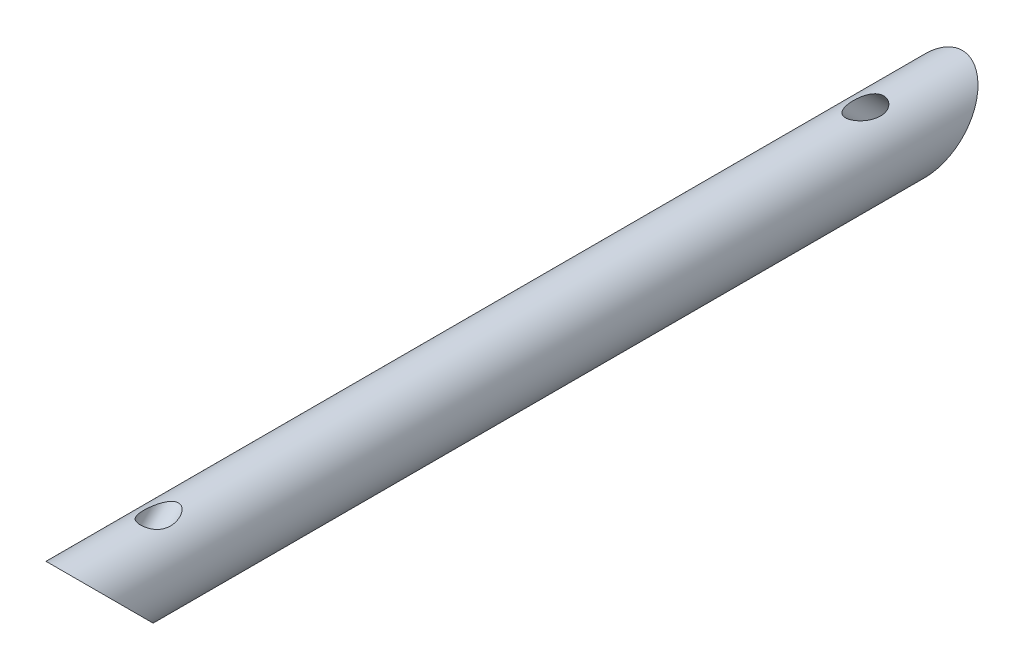
ISO-10303-21;
HEADER;
FILE_DESCRIPTION(('STEP AP214'),'2;1');
FILE_NAME('part.step','',(''),(''),'','','');
FILE_SCHEMA(('AUTOMOTIVE_DESIGN { 1 0 10303 214 1 1 1 1 }'));
ENDSEC;
DATA;
#1=APPLICATION_CONTEXT('core data for automotive mechanical design processes');
#2=APPLICATION_PROTOCOL_DEFINITION('international standard','automotive_design',2000,#1);
#3=PRODUCT_CONTEXT('',#1,'mechanical');
#4=PRODUCT('Part','Part','',(#3));
#5=PRODUCT_RELATED_PRODUCT_CATEGORY('part','',(#4));
#6=PRODUCT_DEFINITION_FORMATION('','',#4);
#7=PRODUCT_DEFINITION_CONTEXT('part definition',#1,'design');
#8=PRODUCT_DEFINITION('design','',#6,#7);
#9=PRODUCT_DEFINITION_SHAPE('','',#8);
#10=(LENGTH_UNIT() NAMED_UNIT(*) SI_UNIT(.MILLI.,.METRE.));
#11=(NAMED_UNIT(*) PLANE_ANGLE_UNIT() SI_UNIT($,.RADIAN.));
#12=(NAMED_UNIT(*) SI_UNIT($,.STERADIAN.) SOLID_ANGLE_UNIT());
#13=UNCERTAINTY_MEASURE_WITH_UNIT(LENGTH_MEASURE(1.E-05),#10,'distance_accuracy_value','');
#14=(GEOMETRIC_REPRESENTATION_CONTEXT(3) GLOBAL_UNCERTAINTY_ASSIGNED_CONTEXT((#13)) GLOBAL_UNIT_ASSIGNED_CONTEXT((#10,
#11,#12)) REPRESENTATION_CONTEXT('',''));
#15=CARTESIAN_POINT('',(0.,0.,0.));
#16=DIRECTION('',(0.,0.,1.));
#17=DIRECTION('',(1.,0.,0.));
#18=AXIS2_PLACEMENT_3D('',#15,#16,#17);
#19=CARTESIAN_POINT('',(0.,0.,63.3730000000001));
#20=DIRECTION('',(0.,0.,-1.));
#21=DIRECTION('',(-1.,0.,0.));
#22=AXIS2_PLACEMENT_3D('',#19,#20,#21);
#23=CYLINDRICAL_SURFACE('',#22,3.175);
#24=CARTESIAN_POINT('',(0.,3.17500000000001,62.4760573640767));
#25=CARTESIAN_POINT('',(0.0374834130594243,3.17499908283403,62.4760613231574));
#26=CARTESIAN_POINT('',(0.0749864602227436,3.17432824369062,62.4793917521914));
#27=CARTESIAN_POINT('',(0.148840239387552,3.17172577653786,62.4923781259647));
#28=CARTESIAN_POINT('',(0.185189481485274,3.16979258277647,62.5020419263077));
#29=CARTESIAN_POINT('',(0.263964599226041,3.16430769845105,62.5296895493285));
#30=CARTESIAN_POINT('',(0.305876380743758,3.16048678870583,62.5490716760683));
#31=CARTESIAN_POINT('',(0.385947639527939,3.15171406014512,62.5942326241791));
#32=CARTESIAN_POINT('',(0.424100075551041,3.1467601747919,62.6200231419252));
#33=CARTESIAN_POINT('',(0.515526607482378,3.13336519861989,62.6910693929809));
#34=CARTESIAN_POINT('',(0.566279936152403,3.12445489309156,62.7394529188589));
#35=CARTESIAN_POINT('',(0.659831061636663,3.10604683939804,62.8432555241803));
#36=CARTESIAN_POINT('',(0.702608452299118,3.09654766508919,62.8986920556618));
#37=CARTESIAN_POINT('',(0.77455904781887,3.07925393670788,63.0045228631761));
#38=CARTESIAN_POINT('',(0.804810066878168,3.0714417548507,63.0541937230361));
#39=CARTESIAN_POINT('',(0.860956606989947,3.05617779839635,63.1560073775087));
#40=CARTESIAN_POINT('',(0.886849279579085,3.04872626175313,63.2081517604172));
#41=CARTESIAN_POINT('',(0.958551604640009,3.02726303952095,63.3675351626859));
#42=CARTESIAN_POINT('',(0.998335893117838,3.01415574687032,63.4776477301824));
#43=CARTESIAN_POINT('',(1.06465224579865,2.99139012604209,63.7086735014768));
#44=CARTESIAN_POINT('',(1.09033685782707,2.9819606500878,63.8298477802075));
#45=CARTESIAN_POINT('',(1.12407490937722,2.96941569807927,64.0749108763587));
#46=CARTESIAN_POINT('',(1.13215871891452,2.96628934673537,64.1987946447963));
#47=CARTESIAN_POINT('',(1.1283188814641,2.96774425787937,64.4133252434276));
#48=CARTESIAN_POINT('',(1.12113747830104,2.97049949005817,64.5040636885038));
#49=CARTESIAN_POINT('',(1.09377643977065,2.98068999333361,64.6833149182491));
#50=CARTESIAN_POINT('',(1.07361716547831,2.98811793297005,64.7718309640245));
#51=CARTESIAN_POINT('',(1.02392656640359,3.00544976750212,64.9260352488518));
#52=CARTESIAN_POINT('',(0.997149795659033,3.01453828620718,64.9926938741853));
#53=CARTESIAN_POINT('',(0.933258885193411,3.0349263452253,65.1205587889725));
#54=CARTESIAN_POINT('',(0.896148981191769,3.04622497901285,65.1817672989775));
#55=CARTESIAN_POINT('',(0.811034535475646,3.06998499368967,65.2967407676653));
#56=CARTESIAN_POINT('',(0.762940341837362,3.08245541593947,65.3504382580461));
#57=CARTESIAN_POINT('',(0.656855972877726,3.10678350780037,65.4471751138649));
#58=CARTESIAN_POINT('',(0.59887269578391,3.11864159708905,65.4902218578832));
#59=CARTESIAN_POINT('',(0.483752398458739,3.13839458037715,65.5583673755363));
#60=CARTESIAN_POINT('',(0.427659508244409,3.14661295432827,65.5851449737221));
#61=CARTESIAN_POINT('',(0.311319294513365,3.16024128036961,65.6284184231077));
#62=CARTESIAN_POINT('',(0.251073712323428,3.16565240159194,65.6449185551231));
#63=CARTESIAN_POINT('',(0.132877844354103,3.17273069099798,65.6663121983137));
#64=CARTESIAN_POINT('',(0.0750770093909175,3.1746404826761,65.6719593058805));
#65=CARTESIAN_POINT('',(-0.0406882054461955,3.17526639942542,65.6738209678093));
#66=CARTESIAN_POINT('',(-0.0986525492962794,3.17398318027839,65.6700374590346));
#67=CARTESIAN_POINT('',(-0.212132066548627,3.16840703715113,65.6532734898886));
#68=CARTESIAN_POINT('',(-0.267671563389201,3.1641624721143,65.6404407680254));
#69=CARTESIAN_POINT('',(-0.375719770861808,3.15315876329112,65.6060783641478));
#70=CARTESIAN_POINT('',(-0.428228636183161,3.14639974797856,65.58454912647));
#71=CARTESIAN_POINT('',(-0.529326137961713,3.13098738048427,65.533147408008));
#72=CARTESIAN_POINT('',(-0.577872178771755,3.12231642183085,65.5031966196145));
#73=CARTESIAN_POINT('',(-0.669344241558663,3.10399478206767,65.4359477361456));
#74=CARTESIAN_POINT('',(-0.712269879470024,3.09434403408475,65.3986491393996));
#75=CARTESIAN_POINT('',(-0.793582943661123,3.07452225298739,65.315988890584));
#76=CARTESIAN_POINT('',(-0.831672781032669,3.06434762157678,65.270336356299));
#77=CARTESIAN_POINT('',(-0.900559723835022,3.04481521430912,65.1736962132735));
#78=CARTESIAN_POINT('',(-0.931353497572707,3.03545781286076,65.1227061824693));
#79=CARTESIAN_POINT('',(-0.995822114725408,3.01504771798124,64.9972004526731));
#80=CARTESIAN_POINT('',(-1.02635050540501,3.00464794918138,64.9209584949803));
#81=CARTESIAN_POINT('',(-1.07510312122169,2.98754635697353,64.7642412904402));
#82=CARTESIAN_POINT('',(-1.09330243254493,2.9808520262385,64.6837578240325));
#83=CARTESIAN_POINT('',(-1.12373820693937,2.96954915506734,64.4903751090213));
#84=CARTESIAN_POINT('',(-1.13118418540178,2.96666241464113,64.3766310052609));
#85=CARTESIAN_POINT('',(-1.12924715986265,2.96738763591896,64.149352253174));
#86=CARTESIAN_POINT('',(-1.11983476538411,2.97101094712318,64.0358183167452));
#87=CARTESIAN_POINT('',(-1.08574279623247,2.9836450925167,63.8075460841021));
#88=CARTESIAN_POINT('',(-1.06057264832954,2.9928287168412,63.6928904019422));
#89=CARTESIAN_POINT('',(-1.01156464684503,3.00959294678324,63.5246194394453));
#90=CARTESIAN_POINT('',(-0.993354224364481,3.0156788245346,63.4691502208721));
#91=CARTESIAN_POINT('',(-0.953073435845767,3.02865069695383,63.3597330311111));
#92=CARTESIAN_POINT('',(-0.931004137144407,3.0355364702002,63.3057846440511));
#93=CARTESIAN_POINT('',(-0.872137940988828,3.05308478400017,63.1763043221435));
#94=CARTESIAN_POINT('',(-0.833147318510797,3.06406933590551,63.1017956031308));
#95=CARTESIAN_POINT('',(-0.745667716088645,3.08652763180049,62.9586131625505));
#96=CARTESIAN_POINT('',(-0.697191457132747,3.09800070469733,62.8899318009628));
#97=CARTESIAN_POINT('',(-0.606734079972008,3.11670855758641,62.7827188274078));
#98=CARTESIAN_POINT('',(-0.56779751497214,3.12410440310835,62.7416634721007));
#99=CARTESIAN_POINT('',(-0.484280815198043,3.13813411011589,62.6655395755375));
#100=CARTESIAN_POINT('',(-0.439709672285096,3.14476915423217,62.6304617001351));
#101=CARTESIAN_POINT('',(-0.357585960462747,3.1549918577585,62.5772682210178));
#102=CARTESIAN_POINT('',(-0.321395628107924,3.15891836340942,62.5571309183613));
#103=CARTESIAN_POINT('',(-0.246204383149144,3.16566306718166,62.5228161984973));
#104=CARTESIAN_POINT('',(-0.207209727056335,3.16848364710988,62.5086259686217));
#105=CARTESIAN_POINT('',(-0.139995021877297,3.17202970886852,62.4908564220094));
#106=CARTESIAN_POINT('',(-0.112302520526211,3.17313642864312,62.4853366222682));
#107=CARTESIAN_POINT('',(-0.0564103802080994,3.17462191246686,62.4779356378527));
#108=CARTESIAN_POINT('',(-0.0282107508380602,3.1750006902771,62.476054384395));
#109=CARTESIAN_POINT('',(0.,3.17500000000001,62.4760573640767));
#110=B_SPLINE_CURVE_WITH_KNOTS('',3,(#24,#25,#26,#27,#28,#29,#30,#31,#32,#33,#34,#35,#36,#37,
#38,#39,#40,#41,#42,#43,#44,#45,#46,#47,#48,#49,#50,#51,#52,#53,#54,#55,#56,#57,#58,#59,#60,#61,
#62,#63,#64,#65,#66,#67,#68,#69,#70,#71,#72,#73,#74,#75,#76,#77,#78,#79,#80,#81,#82,#83,#84,#85,
#86,#87,#88,#89,#90,#91,#92,#93,#94,#95,#96,#97,#98,#99,#100,#101,#102,#103,#104,#105,#106,#107,
#108,#109),.UNSPECIFIED.,.T.,.F.,(4,2,2,2,2,2,2,2,2,2,2,2,2,2,2,2,2,2,2,2,2,2,2,2,2,2,2,2,2,2,2,
2,2,2,2,2,2,2,2,2,2,2,4),(0.,0.112338138943684,0.224815881000983,0.363045200697871,
0.501528689206786,0.712403256872353,0.923810150563234,1.09960942643569,1.27552315618606,
1.62762445539831,1.99905601239938,2.36984615821917,2.64218930542031,2.91410620939429,
3.1304947907729,3.34679480120354,3.5649276447272,3.78290894526865,3.97000502601979,
4.15702312448349,4.33050584446914,4.50395293744904,4.67463197455428,4.84530229215151,
5.01761527660613,5.1899400297851,5.37015107641281,5.55044425715103,5.79741675173692,
6.04488683564514,6.38509684230392,6.72590054023958,7.07788110944375,7.25385601952704,
7.42978233301633,7.68362662173258,7.93713278990965,8.10789400165331,8.27838606750112,
8.40276522464746,8.52687501823088,8.61142450026314,8.69597238394517),.UNSPECIFIED.);
#111=CARTESIAN_POINT('',(0.,3.17500000000001,62.4760573640767));
#112=VERTEX_POINT('',#111);
#113=EDGE_CURVE('E78',#112,#112,#110,.T.);
#114=ORIENTED_EDGE('',*,*,#113,.T.);
#115=EDGE_LOOP('',(#114));
#116=FACE_BOUND('',#115,.T.);
#117=CARTESIAN_POINT('',(0.,3.17500000000001,3.41499195668189));
#118=CARTESIAN_POINT('',(0.0575469658029136,3.17499616209617,3.41499699623727));
#119=CARTESIAN_POINT('',(0.115156405661768,3.17341834208441,3.41965985241906));
#120=CARTESIAN_POINT('',(0.228797507051827,3.1672595216072,3.4382237108335));
#121=CARTESIAN_POINT('',(0.284825388464469,3.16267187243366,3.45214516623269));
#122=CARTESIAN_POINT('',(0.393524179145294,3.15099123827825,3.48883232281481));
#123=CARTESIAN_POINT('',(0.446200622811635,3.14390251723971,3.51158297812459));
#124=CARTESIAN_POINT('',(0.546863421987397,3.12796513113726,3.56525920498471));
#125=CARTESIAN_POINT('',(0.594852226176735,3.11911739234198,3.59618047683672));
#126=CARTESIAN_POINT('',(0.685885671771446,3.10038510013909,3.66588012000434));
#127=CARTESIAN_POINT('',(0.72882747383953,3.09048493510592,3.70478817301941));
#128=CARTESIAN_POINT('',(0.808040373182122,3.07072738368662,3.78887520339933));
#129=CARTESIAN_POINT('',(0.844309607393002,3.06087000999623,3.83405592601133));
#130=CARTESIAN_POINT('',(0.912569617732397,3.04125125931347,3.93320254384656));
#131=CARTESIAN_POINT('',(0.943975303111413,3.03156242785856,3.98758368991971));
#132=CARTESIAN_POINT('',(0.998874807425657,3.01391798688669,4.10044316795166));
#133=CARTESIAN_POINT('',(1.02236334371748,3.0059635358636,4.15892420421672));
#134=CARTESIAN_POINT('',(1.0719298908264,2.9887481355558,4.30865672342945));
#135=CARTESIAN_POINT('',(1.09337247269132,2.98084101351218,4.40160155124433));
#136=CARTESIAN_POINT('',(1.12198304037733,2.97018409757877,4.58996306585649));
#137=CARTESIAN_POINT('',(1.12912124055668,2.96744506575981,4.68538449225261));
#138=CARTESIAN_POINT('',(1.13088300596502,2.96676866690955,4.84646558334129));
#139=CARTESIAN_POINT('',(1.12871653121573,2.96759971099057,4.91212127252969));
#140=CARTESIAN_POINT('',(1.11911211535354,2.97123572862847,5.04301786207303));
#141=CARTESIAN_POINT('',(1.11167197574718,2.97404152541983,5.10825857798463));
#142=CARTESIAN_POINT('',(1.09183090627415,2.98138247651132,5.2381057173151));
#143=CARTESIAN_POINT('',(1.07941277873249,2.98592362343497,5.30270913793176));
#144=CARTESIAN_POINT('',(1.0497927992154,2.99646583308453,5.43068938274457));
#145=CARTESIAN_POINT('',(1.03259078487595,3.00246694536046,5.4940661652308));
#146=CARTESIAN_POINT('',(0.992949443377114,3.01581246467296,5.62067547410196));
#147=CARTESIAN_POINT('',(0.970396447954191,3.0231851468808,5.68386954628157));
#148=CARTESIAN_POINT('',(0.920081700744097,3.0388765795434,5.80809035855861));
#149=CARTESIAN_POINT('',(0.892316618816012,3.04719593350616,5.86911568317279));
#150=CARTESIAN_POINT('',(0.831377302353052,3.06438154582691,5.98784223189306));
#151=CARTESIAN_POINT('',(0.798238983297259,3.07324394513687,6.04556230101469));
#152=CARTESIAN_POINT('',(0.725834486134612,3.09114573024155,6.15693152095148));
#153=CARTESIAN_POINT('',(0.686579118377622,3.10018477966481,6.21058760987941));
#154=CARTESIAN_POINT('',(0.611996311576122,3.11562804164365,6.29912240470263));
#155=CARTESIAN_POINT('',(0.578231217814853,3.12211497375256,6.3352942635037));
#156=CARTESIAN_POINT('',(0.506387842294441,3.13456957127226,6.40331020610694));
#157=CARTESIAN_POINT('',(0.468306574962877,3.14053687213727,6.43515126030689));
#158=CARTESIAN_POINT('',(0.38707875224875,3.1515864765548,6.49319352138688));
#159=CARTESIAN_POINT('',(0.343871865749023,3.15665603153139,6.51931456728187));
#160=CARTESIAN_POINT('',(0.253176980224138,3.16521337725573,6.56296421896241));
#161=CARTESIAN_POINT('',(0.205703051911683,3.16870615349906,6.58051992127147));
#162=CARTESIAN_POINT('',(0.122052466556337,3.17284503362205,6.60124024272704));
#163=CARTESIAN_POINT('',(0.0865657391472375,3.17402157868842,6.60709491381354));
#164=CARTESIAN_POINT('',(0.0150932107992692,3.17516462603452,6.6127833235844));
#165=CARTESIAN_POINT('',(-0.0208923173915577,3.17513176541098,6.61262023233542));
#166=CARTESIAN_POINT('',(-0.0922506574365333,3.1738601754192,6.60629126227438));
#167=CARTESIAN_POINT('',(-0.12762418667116,3.17262297124839,6.60013297586008));
#168=CARTESIAN_POINT('',(-0.196916977700129,3.16907814432482,6.58237702092394));
#169=CARTESIAN_POINT('',(-0.230835024909652,3.16676964586152,6.5707749023517));
#170=CARTESIAN_POINT('',(-0.308927476958787,3.160260359928,6.53776434834506));
#171=CARTESIAN_POINT('',(-0.352201421470016,3.15567484807595,6.51431180801452));
#172=CARTESIAN_POINT('',(-0.434395065622467,3.14541759745742,6.46092720505872));
#173=CARTESIAN_POINT('',(-0.473304418732735,3.13974336057499,6.43098021971839));
#174=CARTESIAN_POINT('',(-0.567924574947947,3.12434530316837,6.34792083073001));
#175=CARTESIAN_POINT('',(-0.620507862136774,3.11416229495928,6.29135895687439));
#176=CARTESIAN_POINT('',(-0.716554970227561,3.09347517632526,6.17105259666346));
#177=CARTESIAN_POINT('',(-0.759996106363505,3.08297033955873,6.1072908329483));
#178=CARTESIAN_POINT('',(-0.831623971920333,3.06433044943664,5.98728155056329));
#179=CARTESIAN_POINT('',(-0.861145835062884,3.0561168055181,5.93182922875789));
#180=CARTESIAN_POINT('',(-0.915400034143196,3.04030712836007,5.81851572434344));
#181=CARTESIAN_POINT('',(-0.940129449299356,3.0327114733827,5.76065309869586));
#182=CARTESIAN_POINT('',(-0.985104074212775,3.01840213296415,5.64299803153776));
#183=CARTESIAN_POINT('',(-1.005341448774,3.01168999676054,5.58320242329513));
#184=CARTESIAN_POINT('',(-1.04139970289673,2.99941228655682,5.46217806678887));
#185=CARTESIAN_POINT('',(-1.05722034135306,2.99384677515415,5.40094924048497));
#186=CARTESIAN_POINT('',(-1.0849372940593,2.98391710378639,5.27501965223364));
#187=CARTESIAN_POINT('',(-1.09665903766268,2.97960745611445,5.21027598541591));
#188=CARTESIAN_POINT('',(-1.1151053265212,2.97275328562703,5.07996459098223));
#189=CARTESIAN_POINT('',(-1.12182861053366,2.97020920832209,5.01439665962393));
#190=CARTESIAN_POINT('',(-1.12988878316544,2.96715289710561,4.88305003754043));
#191=CARTESIAN_POINT('',(-1.13124058146427,2.96663503906108,4.81727243811314));
#192=CARTESIAN_POINT('',(-1.12806314523369,2.96784443871198,4.68591212183187));
#193=CARTESIAN_POINT('',(-1.12353785634536,2.96957019013864,4.62032930382606));
#194=CARTESIAN_POINT('',(-1.1060256229337,2.97614723731939,4.47413755350166));
#195=CARTESIAN_POINT('',(-1.09124763981754,2.9816568923642,4.39375545263313));
#196=CARTESIAN_POINT('',(-1.05004359419724,2.99641736582071,4.23639903019055));
#197=CARTESIAN_POINT('',(-1.02363465971325,3.0056626813619,4.15941988009198));
#198=CARTESIAN_POINT('',(-0.96333595101923,3.02546368902725,4.02393831884604));
#199=CARTESIAN_POINT('',(-0.931424260390282,3.03554479228619,3.9644937456761));
#200=CARTESIAN_POINT('',(-0.858241589232965,3.05704055100699,3.85189102934531));
#201=CARTESIAN_POINT('',(-0.81697418771904,3.06845469570819,3.79873049403517));
#202=CARTESIAN_POINT('',(-0.725123871829526,3.09145062450973,3.70050460557648));
#203=CARTESIAN_POINT('',(-0.674484647158541,3.10303300962814,3.65549162571844));
#204=CARTESIAN_POINT('',(-0.565234776982635,3.12477525404836,3.57591873857571));
#205=CARTESIAN_POINT('',(-0.506623156485704,3.13493493905075,3.54136011148559));
#206=CARTESIAN_POINT('',(-0.390522490059555,3.1513738712596,3.48745384777546));
#207=CARTESIAN_POINT('',(-0.333670540538712,3.15796388024087,3.46681927893449));
#208=CARTESIAN_POINT('',(-0.217128390472756,3.1681028798409,3.43557909410305));
#209=CARTESIAN_POINT('',(-0.157446224410773,3.17165999183364,3.42494668676382));
#210=CARTESIAN_POINT('',(-0.0649709718946767,3.17450245429316,3.41647145701584));
#211=CARTESIAN_POINT('',(-0.0324954461885266,3.17500216717591,3.41498911096104));
#212=CARTESIAN_POINT('',(0.,3.17500000000001,3.41499195668189));
#213=B_SPLINE_CURVE_WITH_KNOTS('',3,(#117,#118,#119,#120,#121,#122,#123,#124,#125,#126,#127,
#128,#129,#130,#131,#132,#133,#134,#135,#136,#137,#138,#139,#140,#141,#142,#143,#144,#145,#146,
#147,#148,#149,#150,#151,#152,#153,#154,#155,#156,#157,#158,#159,#160,#161,#162,#163,#164,#165,
#166,#167,#168,#169,#170,#171,#172,#173,#174,#175,#176,#177,#178,#179,#180,#181,#182,#183,#184,
#185,#186,#187,#188,#189,#190,#191,#192,#193,#194,#195,#196,#197,#198,#199,#200,#201,#202,#203,
#204,#205,#206,#207,#208,#209,#210,#211,#212),.UNSPECIFIED.,.T.,.F.,(4,2,2,2,2,2,2,2,2,2,2,2,2,
2,2,2,2,2,2,2,2,2,2,2,2,2,2,2,2,2,2,2,2,2,2,2,2,2,2,2,2,2,2,2,2,2,2,4),(0.,0.172541146773812,
0.345464725830227,0.518094910032727,0.690634429770364,0.866235513072081,1.041885552206,
1.23177315798526,1.42178721482838,1.70733429129484,1.99347533972966,2.19033133281801,
2.38726943983662,2.58489386344524,2.78252499520018,2.9848045296782,3.18721374856093,
3.38832194362329,3.58907867892935,3.73850063688532,3.88802659077019,4.03953014036355,
4.19055124861339,4.29802313141185,4.40543840044805,4.51271781403078,4.62008507615875,
4.767550920579,4.91535926663766,5.14775358980532,5.38071793438012,5.57053919548398,
5.7604757827832,5.95074110618428,6.14101681394749,6.33861939531173,6.53627182009256,
6.73337523447895,6.93034638990321,7.17524666148568,7.4197874866527,7.62360612400301,
7.82734692198641,8.03235416315018,8.23738649845634,8.41898905406102,8.60010378031405,
8.69753379199358),.UNSPECIFIED.);
#214=CARTESIAN_POINT('',(0.,3.17500000000001,3.41499195668189));
#215=VERTEX_POINT('',#214);
#216=EDGE_CURVE('E52',#215,#215,#213,.T.);
#217=ORIENTED_EDGE('',*,*,#216,.T.);
#218=EDGE_LOOP('',(#217));
#219=FACE_BOUND('',#218,.T.);
#220=CARTESIAN_POINT('',(0.,0.,69.0880204998591));
#221=DIRECTION('',(0.,-0.707106781186549,0.707106781186547));
#222=DIRECTION('',(0.,-0.707106781186547,-0.707106781186549));
#223=AXIS2_PLACEMENT_3D('',#220,#221,#222);
#224=ELLIPSE('',#223,4.49012806053458,3.175);
#225=CARTESIAN_POINT('',(0.,-3.17500000000003,65.9130204998591));
#226=VERTEX_POINT('',#225);
#227=EDGE_CURVE('E11',#226,#226,#224,.T.);
#228=ORIENTED_EDGE('',*,*,#227,.F.);
#229=EDGE_LOOP('',(#228));
#230=FACE_BOUND('',#229,.T.);
#231=CARTESIAN_POINT('',(0.,0.,0.));
#232=DIRECTION('',(0.,0.707106781186549,0.707106781186547));
#233=DIRECTION('',(0.,0.707106781186547,-0.70710678118655));
#234=AXIS2_PLACEMENT_3D('',#231,#232,#233);
#235=ELLIPSE('',#234,4.49012806053458,3.175);
#236=CARTESIAN_POINT('',(0.,3.175,-3.17500000000001));
#237=VERTEX_POINT('',#236);
#238=EDGE_CURVE('E46',#237,#237,#235,.T.);
#239=ORIENTED_EDGE('',*,*,#238,.T.);
#240=EDGE_LOOP('',(#239));
#241=FACE_BOUND('',#240,.T.);
#242=ADVANCED_FACE('F38',(#116,#219,#230,#241),#23,.T.);
#243=CARTESIAN_POINT('',(0.,-9.75615024992955,59.3318702499296));
#244=DIRECTION('',(0.,-0.707106781186549,0.707106781186547));
#245=DIRECTION('',(1.,0.,0.));
#246=AXIS2_PLACEMENT_3D('',#243,#244,#245);
#247=PLANE('',#246);
#248=CARTESIAN_POINT('',(0.,-0.919238773116088,68.1687817267431));
#249=DIRECTION('',(0.,-0.707106781186549,0.707106781186547));
#250=DIRECTION('',(0.,-0.707106781186547,-0.707106781186549));
#251=AXIS2_PLACEMENT_3D('',#248,#249,#250);
#252=CIRCLE('',#251,1.1303);
#253=CARTESIAN_POINT('',(0.,-1.71848156789124,67.3695389319679));
#254=VERTEX_POINT('',#253);
#255=EDGE_CURVE('E84',#254,#254,#252,.T.);
#256=ORIENTED_EDGE('',*,*,#255,.F.);
#257=EDGE_LOOP('',(#256));
#258=FACE_BOUND('',#257,.T.);
#259=ORIENTED_EDGE('',*,*,#227,.T.);
#260=EDGE_LOOP('',(#259));
#261=FACE_BOUND('',#260,.T.);
#262=ADVANCED_FACE('F40',(#258,#261),#247,.T.);
#263=CARTESIAN_POINT('',(0.,0.,0.));
#264=DIRECTION('',(0.,0.707106781186549,0.707106781186547));
#265=DIRECTION('',(1.,0.,0.));
#266=AXIS2_PLACEMENT_3D('',#263,#264,#265);
#267=PLANE('',#266);
#268=CARTESIAN_POINT('',(0.,-0.919238773116095,0.919238773116102));
#269=DIRECTION('',(0.,-0.707106781186549,-0.707106781186547));
#270=DIRECTION('',(0.,0.707106781186547,-0.70710678118655));
#271=AXIS2_PLACEMENT_3D('',#268,#269,#270);
#272=CIRCLE('',#271,1.1303);
#273=CARTESIAN_POINT('',(0.,-0.119995978340941,0.119995978340945));
#274=VERTEX_POINT('',#273);
#275=EDGE_CURVE('E58',#274,#274,#272,.T.);
#276=ORIENTED_EDGE('',*,*,#275,.F.);
#277=EDGE_LOOP('',(#276));
#278=FACE_BOUND('',#277,.T.);
#279=ORIENTED_EDGE('',*,*,#238,.F.);
#280=EDGE_LOOP('',(#279));
#281=FACE_BOUND('',#280,.T.);
#282=ADVANCED_FACE('F73',(#278,#281),#267,.F.);
#283=CARTESIAN_POINT('',(0.,-0.919238773116095,0.919238773116102));
#284=DIRECTION('',(0.,-0.707106781186549,-0.707106781186547));
#285=DIRECTION('',(0.,0.707106781186547,-0.70710678118655));
#286=AXIS2_PLACEMENT_3D('',#283,#284,#285);
#287=CYLINDRICAL_SURFACE('',#286,1.13029999999999);
#288=ORIENTED_EDGE('',*,*,#216,.F.);
#289=EDGE_LOOP('',(#288));
#290=FACE_BOUND('',#289,.T.);
#291=ORIENTED_EDGE('',*,*,#275,.T.);
#292=EDGE_LOOP('',(#291));
#293=FACE_BOUND('',#292,.T.);
#294=ADVANCED_FACE('F68',(#290,#293),#287,.F.);
#295=CARTESIAN_POINT('',(0.,-0.919238773116088,68.1687817267431));
#296=DIRECTION('',(0.,-0.707106781186549,0.707106781186547));
#297=DIRECTION('',(0.,-0.707106781186547,-0.707106781186549));
#298=AXIS2_PLACEMENT_3D('',#295,#296,#297);
#299=CYLINDRICAL_SURFACE('',#298,1.1303);
#300=ORIENTED_EDGE('',*,*,#113,.F.);
#301=EDGE_LOOP('',(#300));
#302=FACE_BOUND('',#301,.T.);
#303=ORIENTED_EDGE('',*,*,#255,.T.);
#304=EDGE_LOOP('',(#303));
#305=FACE_BOUND('',#304,.T.);
#306=ADVANCED_FACE('F72',(#302,#305),#299,.F.);
#307=CLOSED_SHELL('',(#242,#262,#282,#294,#306));
#308=MANIFOLD_SOLID_BREP('B2',#307);
#309=ADVANCED_BREP_SHAPE_REPRESENTATION('',(#18,#308),#14);
#310=SHAPE_DEFINITION_REPRESENTATION(#9,#309);
ENDSEC;
END-ISO-10303-21;
